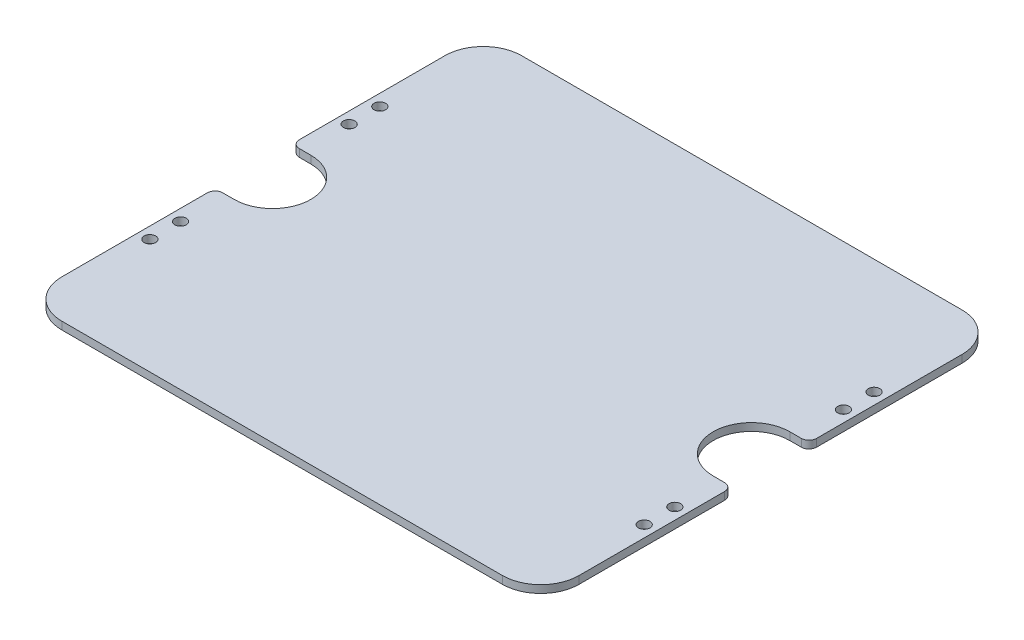
ISO-10303-21;
HEADER;
FILE_DESCRIPTION(('STEP AP214'),'2;1');
FILE_NAME('part.step','',(''),(''),'','','');
FILE_SCHEMA(('AUTOMOTIVE_DESIGN { 1 0 10303 214 1 1 1 1 }'));
ENDSEC;
DATA;
#1=APPLICATION_CONTEXT('core data for automotive mechanical design processes');
#2=APPLICATION_PROTOCOL_DEFINITION('international standard','automotive_design',2000,#1);
#3=PRODUCT_CONTEXT('',#1,'mechanical');
#4=PRODUCT('Part','Part','',(#3));
#5=PRODUCT_RELATED_PRODUCT_CATEGORY('part','',(#4));
#6=PRODUCT_DEFINITION_FORMATION('','',#4);
#7=PRODUCT_DEFINITION_CONTEXT('part definition',#1,'design');
#8=PRODUCT_DEFINITION('design','',#6,#7);
#9=PRODUCT_DEFINITION_SHAPE('','',#8);
#10=(LENGTH_UNIT() NAMED_UNIT(*) SI_UNIT(.MILLI.,.METRE.));
#11=(NAMED_UNIT(*) PLANE_ANGLE_UNIT() SI_UNIT($,.RADIAN.));
#12=(NAMED_UNIT(*) SI_UNIT($,.STERADIAN.) SOLID_ANGLE_UNIT());
#13=UNCERTAINTY_MEASURE_WITH_UNIT(LENGTH_MEASURE(1.E-05),#10,'distance_accuracy_value','');
#14=(GEOMETRIC_REPRESENTATION_CONTEXT(3) GLOBAL_UNCERTAINTY_ASSIGNED_CONTEXT((#13)) GLOBAL_UNIT_ASSIGNED_CONTEXT((#10,
#11,#12)) REPRESENTATION_CONTEXT('',''));
#15=CARTESIAN_POINT('',(0.,0.,0.));
#16=DIRECTION('',(0.,0.,1.));
#17=DIRECTION('',(1.,0.,0.));
#18=AXIS2_PLACEMENT_3D('',#15,#16,#17);
#19=CARTESIAN_POINT('',(-62.5,2.,0.));
#20=DIRECTION('',(0.,-1.,0.));
#21=DIRECTION('',(0.,0.,-1.));
#22=AXIS2_PLACEMENT_3D('',#19,#20,#21);
#23=PLANE('',#22);
#24=CARTESIAN_POINT('',(-62.5,2.,0.));
#25=DIRECTION('',(0.,-1.,0.));
#26=DIRECTION('',(0.,0.,-1.));
#27=AXIS2_PLACEMENT_3D('',#24,#25,#26);
#28=CIRCLE('',#27,10.);
#29=CARTESIAN_POINT('',(-62.5,2.,-9.99999999999999));
#30=VERTEX_POINT('',#29);
#31=CARTESIAN_POINT('',(-62.5,2.,10.));
#32=VERTEX_POINT('',#31);
#33=EDGE_CURVE('E245',#30,#32,#28,.T.);
#34=ORIENTED_EDGE('',*,*,#33,.T.);
#35=DIRECTION('',(-1.,0.,0.));
#36=VECTOR('',#35,1.);
#37=CARTESIAN_POINT('',(-65.5,2.,10.));
#38=LINE('',#37,#36);
#39=CARTESIAN_POINT('',(-65.5,2.,10.));
#40=VERTEX_POINT('',#39);
#41=EDGE_CURVE('E133',#32,#40,#38,.T.);
#42=ORIENTED_EDGE('',*,*,#41,.T.);
#43=CARTESIAN_POINT('',(-65.5,2.,12.));
#44=DIRECTION('',(0.,1.,0.));
#45=DIRECTION('',(0.,0.,-1.));
#46=AXIS2_PLACEMENT_3D('',#43,#44,#45);
#47=CIRCLE('',#46,2.);
#48=CARTESIAN_POINT('',(-67.5,2.,12.));
#49=VERTEX_POINT('',#48);
#50=EDGE_CURVE('E296',#40,#49,#47,.T.);
#51=ORIENTED_EDGE('',*,*,#50,.T.);
#52=DIRECTION('',(0.,0.,1.));
#53=VECTOR('',#52,1.);
#54=CARTESIAN_POINT('',(-67.5,2.,12.));
#55=LINE('',#54,#53);
#56=CARTESIAN_POINT('',(-67.5,2.,49.9999999999999));
#57=VERTEX_POINT('',#56);
#58=EDGE_CURVE('E315',#49,#57,#55,.T.);
#59=ORIENTED_EDGE('',*,*,#58,.T.);
#60=CARTESIAN_POINT('',(-57.5,2.,50.));
#61=DIRECTION('',(0.,1.,0.));
#62=DIRECTION('',(0.,0.,-1.));
#63=AXIS2_PLACEMENT_3D('',#60,#61,#62);
#64=CIRCLE('',#63,9.99999999999999);
#65=CARTESIAN_POINT('',(-57.4999999999999,2.,60.));
#66=VERTEX_POINT('',#65);
#67=EDGE_CURVE('E312',#57,#66,#64,.T.);
#68=ORIENTED_EDGE('',*,*,#67,.T.);
#69=DIRECTION('',(1.,0.,0.));
#70=VECTOR('',#69,1.);
#71=CARTESIAN_POINT('',(-57.4999999999999,2.,60.));
#72=LINE('',#71,#70);
#73=CARTESIAN_POINT('',(57.4999999999999,2.,60.));
#74=VERTEX_POINT('',#73);
#75=EDGE_CURVE('E314',#66,#74,#72,.T.);
#76=ORIENTED_EDGE('',*,*,#75,.T.);
#77=CARTESIAN_POINT('',(57.5,2.,50.));
#78=DIRECTION('',(0.,1.,0.));
#79=DIRECTION('',(0.,0.,1.));
#80=AXIS2_PLACEMENT_3D('',#77,#78,#79);
#81=CIRCLE('',#80,10.);
#82=CARTESIAN_POINT('',(67.5,2.,49.9999999999999));
#83=VERTEX_POINT('',#82);
#84=EDGE_CURVE('E317',#74,#83,#81,.T.);
#85=ORIENTED_EDGE('',*,*,#84,.T.);
#86=DIRECTION('',(0.,0.,-1.));
#87=VECTOR('',#86,1.);
#88=CARTESIAN_POINT('',(67.5,2.,12.));
#89=LINE('',#88,#87);
#90=CARTESIAN_POINT('',(67.5,2.,12.));
#91=VERTEX_POINT('',#90);
#92=EDGE_CURVE('E323',#83,#91,#89,.T.);
#93=ORIENTED_EDGE('',*,*,#92,.T.);
#94=CARTESIAN_POINT('',(65.5,2.,12.));
#95=DIRECTION('',(0.,1.,0.));
#96=DIRECTION('',(0.,0.,1.));
#97=AXIS2_PLACEMENT_3D('',#94,#95,#96);
#98=CIRCLE('',#97,2.);
#99=CARTESIAN_POINT('',(65.5,2.,10.));
#100=VERTEX_POINT('',#99);
#101=EDGE_CURVE('E325',#91,#100,#98,.T.);
#102=ORIENTED_EDGE('',*,*,#101,.T.);
#103=DIRECTION('',(-1.,0.,0.));
#104=VECTOR('',#103,1.);
#105=CARTESIAN_POINT('',(65.5,2.,10.));
#106=LINE('',#105,#104);
#107=CARTESIAN_POINT('',(62.5,2.,10.));
#108=VERTEX_POINT('',#107);
#109=EDGE_CURVE('E327',#100,#108,#106,.T.);
#110=ORIENTED_EDGE('',*,*,#109,.T.);
#111=CARTESIAN_POINT('',(62.5,2.,0.));
#112=DIRECTION('',(0.,-1.,0.));
#113=DIRECTION('',(0.,0.,1.));
#114=AXIS2_PLACEMENT_3D('',#111,#112,#113);
#115=CIRCLE('',#114,10.);
#116=CARTESIAN_POINT('',(62.5,2.,-9.99999999999999));
#117=VERTEX_POINT('',#116);
#118=EDGE_CURVE('E329',#108,#117,#115,.T.);
#119=ORIENTED_EDGE('',*,*,#118,.T.);
#120=DIRECTION('',(1.,0.,0.));
#121=VECTOR('',#120,1.);
#122=CARTESIAN_POINT('',(65.5,2.,-9.99999999999999));
#123=LINE('',#122,#121);
#124=CARTESIAN_POINT('',(65.5,2.,-9.99999999999999));
#125=VERTEX_POINT('',#124);
#126=EDGE_CURVE('E331',#117,#125,#123,.T.);
#127=ORIENTED_EDGE('',*,*,#126,.T.);
#128=CARTESIAN_POINT('',(65.5,2.,-12.));
#129=DIRECTION('',(0.,1.,0.));
#130=DIRECTION('',(0.,0.,-1.));
#131=AXIS2_PLACEMENT_3D('',#128,#129,#130);
#132=CIRCLE('',#131,2.);
#133=CARTESIAN_POINT('',(67.5,2.,-12.));
#134=VERTEX_POINT('',#133);
#135=EDGE_CURVE('E333',#125,#134,#132,.T.);
#136=ORIENTED_EDGE('',*,*,#135,.T.);
#137=DIRECTION('',(0.,0.,-1.));
#138=VECTOR('',#137,1.);
#139=CARTESIAN_POINT('',(67.5,2.,-49.9999999999999));
#140=LINE('',#139,#138);
#141=CARTESIAN_POINT('',(67.5,2.,-49.9999999999999));
#142=VERTEX_POINT('',#141);
#143=EDGE_CURVE('E335',#134,#142,#140,.T.);
#144=ORIENTED_EDGE('',*,*,#143,.T.);
#145=CARTESIAN_POINT('',(57.5,2.,-50.));
#146=DIRECTION('',(0.,1.,0.));
#147=DIRECTION('',(0.,0.,1.));
#148=AXIS2_PLACEMENT_3D('',#145,#146,#147);
#149=CIRCLE('',#148,10.);
#150=CARTESIAN_POINT('',(57.4999999999999,2.,-60.));
#151=VERTEX_POINT('',#150);
#152=EDGE_CURVE('E337',#142,#151,#149,.T.);
#153=ORIENTED_EDGE('',*,*,#152,.T.);
#154=DIRECTION('',(-1.,0.,0.));
#155=VECTOR('',#154,1.);
#156=CARTESIAN_POINT('',(-57.4999999999999,2.,-60.));
#157=LINE('',#156,#155);
#158=CARTESIAN_POINT('',(-57.5,2.,-60.));
#159=VERTEX_POINT('',#158);
#160=EDGE_CURVE('E339',#151,#159,#157,.T.);
#161=ORIENTED_EDGE('',*,*,#160,.T.);
#162=CARTESIAN_POINT('',(-57.5,2.,-50.));
#163=DIRECTION('',(0.,1.,0.));
#164=DIRECTION('',(0.,0.,-1.));
#165=AXIS2_PLACEMENT_3D('',#162,#163,#164);
#166=CIRCLE('',#165,10.);
#167=CARTESIAN_POINT('',(-67.5,2.,-49.9999999999999));
#168=VERTEX_POINT('',#167);
#169=EDGE_CURVE('E188',#159,#168,#166,.T.);
#170=ORIENTED_EDGE('',*,*,#169,.T.);
#171=DIRECTION('',(0.,0.,1.));
#172=VECTOR('',#171,1.);
#173=CARTESIAN_POINT('',(-67.5,2.,-49.9999999999999));
#174=LINE('',#173,#172);
#175=CARTESIAN_POINT('',(-67.5,2.,-12.));
#176=VERTEX_POINT('',#175);
#177=EDGE_CURVE('E182',#168,#176,#174,.T.);
#178=ORIENTED_EDGE('',*,*,#177,.T.);
#179=CARTESIAN_POINT('',(-65.5,2.,-12.));
#180=DIRECTION('',(0.,1.,0.));
#181=DIRECTION('',(0.,0.,-1.));
#182=AXIS2_PLACEMENT_3D('',#179,#180,#181);
#183=CIRCLE('',#182,2.);
#184=CARTESIAN_POINT('',(-65.5,2.,-9.99999999999999));
#185=VERTEX_POINT('',#184);
#186=EDGE_CURVE('E186',#176,#185,#183,.T.);
#187=ORIENTED_EDGE('',*,*,#186,.T.);
#188=DIRECTION('',(1.,0.,0.));
#189=VECTOR('',#188,1.);
#190=CARTESIAN_POINT('',(-65.5,2.,-9.99999999999999));
#191=LINE('',#190,#189);
#192=EDGE_CURVE('E54',#185,#30,#191,.T.);
#193=ORIENTED_EDGE('',*,*,#192,.T.);
#194=EDGE_LOOP('',(#34,#42,#51,#59,#68,#76,#85,#93,#102,#110,#119,#127,#136,#144,#153,#161,#170,
#178,#187,#193));
#195=FACE_BOUND('',#194,.T.);
#196=CARTESIAN_POINT('',(-64.5,2.,-30.));
#197=DIRECTION('',(0.,1.,0.));
#198=DIRECTION('',(0.,0.,1.));
#199=AXIS2_PLACEMENT_3D('',#196,#197,#198);
#200=CIRCLE('',#199,1.5);
#201=CARTESIAN_POINT('',(-64.5,2.,-28.5));
#202=VERTEX_POINT('',#201);
#203=EDGE_CURVE('E210',#202,#202,#200,.T.);
#204=ORIENTED_EDGE('',*,*,#203,.F.);
#205=EDGE_LOOP('',(#204));
#206=FACE_BOUND('',#205,.T.);
#207=CARTESIAN_POINT('',(64.5,2.,-30.));
#208=DIRECTION('',(0.,1.,0.));
#209=DIRECTION('',(0.,0.,1.));
#210=AXIS2_PLACEMENT_3D('',#207,#208,#209);
#211=CIRCLE('',#210,1.5);
#212=CARTESIAN_POINT('',(64.5,2.,-28.5));
#213=VERTEX_POINT('',#212);
#214=EDGE_CURVE('E443',#213,#213,#211,.T.);
#215=ORIENTED_EDGE('',*,*,#214,.F.);
#216=EDGE_LOOP('',(#215));
#217=FACE_BOUND('',#216,.T.);
#218=CARTESIAN_POINT('',(64.5,2.,30.));
#219=DIRECTION('',(0.,1.,0.));
#220=DIRECTION('',(0.,0.,1.));
#221=AXIS2_PLACEMENT_3D('',#218,#219,#220);
#222=CIRCLE('',#221,1.5);
#223=CARTESIAN_POINT('',(64.5,2.,31.5));
#224=VERTEX_POINT('',#223);
#225=EDGE_CURVE('E437',#224,#224,#222,.T.);
#226=ORIENTED_EDGE('',*,*,#225,.F.);
#227=EDGE_LOOP('',(#226));
#228=FACE_BOUND('',#227,.T.);
#229=CARTESIAN_POINT('',(-64.5,2.,30.));
#230=DIRECTION('',(0.,1.,0.));
#231=DIRECTION('',(0.,0.,1.));
#232=AXIS2_PLACEMENT_3D('',#229,#230,#231);
#233=CIRCLE('',#232,1.5);
#234=CARTESIAN_POINT('',(-64.5,2.,31.5));
#235=VERTEX_POINT('',#234);
#236=EDGE_CURVE('E431',#235,#235,#233,.T.);
#237=ORIENTED_EDGE('',*,*,#236,.F.);
#238=EDGE_LOOP('',(#237));
#239=FACE_BOUND('',#238,.T.);
#240=CARTESIAN_POINT('',(-64.5,2.,-22.));
#241=DIRECTION('',(0.,1.,0.));
#242=DIRECTION('',(0.,0.,1.));
#243=AXIS2_PLACEMENT_3D('',#240,#241,#242);
#244=CIRCLE('',#243,1.5);
#245=CARTESIAN_POINT('',(-64.5,2.,-20.5));
#246=VERTEX_POINT('',#245);
#247=EDGE_CURVE('E425',#246,#246,#244,.T.);
#248=ORIENTED_EDGE('',*,*,#247,.F.);
#249=EDGE_LOOP('',(#248));
#250=FACE_BOUND('',#249,.T.);
#251=CARTESIAN_POINT('',(64.5,2.,-22.));
#252=DIRECTION('',(0.,1.,0.));
#253=DIRECTION('',(0.,0.,-1.));
#254=AXIS2_PLACEMENT_3D('',#251,#252,#253);
#255=CIRCLE('',#254,1.5);
#256=CARTESIAN_POINT('',(64.5,2.,-23.5));
#257=VERTEX_POINT('',#256);
#258=EDGE_CURVE('E419',#257,#257,#255,.T.);
#259=ORIENTED_EDGE('',*,*,#258,.F.);
#260=EDGE_LOOP('',(#259));
#261=FACE_BOUND('',#260,.T.);
#262=CARTESIAN_POINT('',(64.5,2.,22.));
#263=DIRECTION('',(0.,1.,0.));
#264=DIRECTION('',(0.,0.,1.));
#265=AXIS2_PLACEMENT_3D('',#262,#263,#264);
#266=CIRCLE('',#265,1.5);
#267=CARTESIAN_POINT('',(64.5,2.,23.5));
#268=VERTEX_POINT('',#267);
#269=EDGE_CURVE('E413',#268,#268,#266,.T.);
#270=ORIENTED_EDGE('',*,*,#269,.F.);
#271=EDGE_LOOP('',(#270));
#272=FACE_BOUND('',#271,.T.);
#273=CARTESIAN_POINT('',(-64.5,2.,22.));
#274=DIRECTION('',(0.,1.,0.));
#275=DIRECTION('',(0.,0.,-1.));
#276=AXIS2_PLACEMENT_3D('',#273,#274,#275);
#277=CIRCLE('',#276,1.5);
#278=CARTESIAN_POINT('',(-64.5,2.,20.5));
#279=VERTEX_POINT('',#278);
#280=EDGE_CURVE('E404',#279,#279,#277,.T.);
#281=ORIENTED_EDGE('',*,*,#280,.F.);
#282=EDGE_LOOP('',(#281));
#283=FACE_BOUND('',#282,.T.);
#284=ADVANCED_FACE('F37',(#195,#206,#217,#228,#239,#250,#261,#272,#283),#23,.F.);
#285=CARTESIAN_POINT('',(-62.5,0.,0.));
#286=DIRECTION('',(0.,-1.,0.));
#287=DIRECTION('',(0.,0.,-1.));
#288=AXIS2_PLACEMENT_3D('',#285,#286,#287);
#289=PLANE('',#288);
#290=CARTESIAN_POINT('',(64.5,0.,22.));
#291=DIRECTION('',(0.,1.,0.));
#292=DIRECTION('',(0.,0.,1.));
#293=AXIS2_PLACEMENT_3D('',#290,#291,#292);
#294=CIRCLE('',#293,1.5);
#295=CARTESIAN_POINT('',(64.5,0.,23.5));
#296=VERTEX_POINT('',#295);
#297=EDGE_CURVE('E410',#296,#296,#294,.T.);
#298=ORIENTED_EDGE('',*,*,#297,.T.);
#299=EDGE_LOOP('',(#298));
#300=FACE_BOUND('',#299,.T.);
#301=CARTESIAN_POINT('',(-64.5,0.,-22.));
#302=DIRECTION('',(0.,1.,0.));
#303=DIRECTION('',(0.,0.,1.));
#304=AXIS2_PLACEMENT_3D('',#301,#302,#303);
#305=CIRCLE('',#304,1.5);
#306=CARTESIAN_POINT('',(-64.5,0.,-20.5));
#307=VERTEX_POINT('',#306);
#308=EDGE_CURVE('E422',#307,#307,#305,.T.);
#309=ORIENTED_EDGE('',*,*,#308,.T.);
#310=EDGE_LOOP('',(#309));
#311=FACE_BOUND('',#310,.T.);
#312=CARTESIAN_POINT('',(64.5,0.,30.));
#313=DIRECTION('',(0.,1.,0.));
#314=DIRECTION('',(0.,0.,1.));
#315=AXIS2_PLACEMENT_3D('',#312,#313,#314);
#316=CIRCLE('',#315,1.5);
#317=CARTESIAN_POINT('',(64.5,0.,31.5));
#318=VERTEX_POINT('',#317);
#319=EDGE_CURVE('E434',#318,#318,#316,.T.);
#320=ORIENTED_EDGE('',*,*,#319,.T.);
#321=EDGE_LOOP('',(#320));
#322=FACE_BOUND('',#321,.T.);
#323=CARTESIAN_POINT('',(-64.5,0.,-30.));
#324=DIRECTION('',(0.,1.,0.));
#325=DIRECTION('',(0.,0.,1.));
#326=AXIS2_PLACEMENT_3D('',#323,#324,#325);
#327=CIRCLE('',#326,1.5);
#328=CARTESIAN_POINT('',(-64.5,0.,-28.5));
#329=VERTEX_POINT('',#328);
#330=EDGE_CURVE('E446',#329,#329,#327,.T.);
#331=ORIENTED_EDGE('',*,*,#330,.T.);
#332=EDGE_LOOP('',(#331));
#333=FACE_BOUND('',#332,.T.);
#334=CARTESIAN_POINT('',(-62.5,0.,0.));
#335=DIRECTION('',(0.,-1.,0.));
#336=DIRECTION('',(0.,0.,-1.));
#337=AXIS2_PLACEMENT_3D('',#334,#335,#336);
#338=CIRCLE('',#337,10.);
#339=CARTESIAN_POINT('',(-62.5,0.,-9.99999999999999));
#340=VERTEX_POINT('',#339);
#341=CARTESIAN_POINT('',(-62.5,0.,10.));
#342=VERTEX_POINT('',#341);
#343=EDGE_CURVE('E206',#340,#342,#338,.T.);
#344=ORIENTED_EDGE('',*,*,#343,.F.);
#345=DIRECTION('',(1.,0.,0.));
#346=VECTOR('',#345,1.);
#347=CARTESIAN_POINT('',(-65.5,0.,-9.99999999999999));
#348=LINE('',#347,#346);
#349=CARTESIAN_POINT('',(-65.5,0.,-9.99999999999999));
#350=VERTEX_POINT('',#349);
#351=EDGE_CURVE('E125',#350,#340,#348,.T.);
#352=ORIENTED_EDGE('',*,*,#351,.F.);
#353=CARTESIAN_POINT('',(-65.5,0.,-12.));
#354=DIRECTION('',(0.,1.,0.));
#355=DIRECTION('',(0.,0.,-1.));
#356=AXIS2_PLACEMENT_3D('',#353,#354,#355);
#357=CIRCLE('',#356,2.);
#358=CARTESIAN_POINT('',(-67.5,0.,-12.));
#359=VERTEX_POINT('',#358);
#360=EDGE_CURVE('E119',#359,#350,#357,.T.);
#361=ORIENTED_EDGE('',*,*,#360,.F.);
#362=DIRECTION('',(0.,0.,1.));
#363=VECTOR('',#362,1.);
#364=CARTESIAN_POINT('',(-67.5,0.,-49.9999999999999));
#365=LINE('',#364,#363);
#366=CARTESIAN_POINT('',(-67.5,0.,-49.9999999999999));
#367=VERTEX_POINT('',#366);
#368=EDGE_CURVE('E196',#367,#359,#365,.T.);
#369=ORIENTED_EDGE('',*,*,#368,.F.);
#370=CARTESIAN_POINT('',(-57.5,0.,-50.));
#371=DIRECTION('',(0.,1.,0.));
#372=DIRECTION('',(0.,0.,-1.));
#373=AXIS2_PLACEMENT_3D('',#370,#371,#372);
#374=CIRCLE('',#373,10.);
#375=CARTESIAN_POINT('',(-57.5,0.,-60.));
#376=VERTEX_POINT('',#375);
#377=EDGE_CURVE('E240',#376,#367,#374,.T.);
#378=ORIENTED_EDGE('',*,*,#377,.F.);
#379=DIRECTION('',(-1.,0.,0.));
#380=VECTOR('',#379,1.);
#381=CARTESIAN_POINT('',(-57.4999999999999,0.,-60.));
#382=LINE('',#381,#380);
#383=CARTESIAN_POINT('',(57.4999999999999,0.,-60.));
#384=VERTEX_POINT('',#383);
#385=EDGE_CURVE('E238',#384,#376,#382,.T.);
#386=ORIENTED_EDGE('',*,*,#385,.F.);
#387=CARTESIAN_POINT('',(57.5,0.,-50.));
#388=DIRECTION('',(0.,1.,0.));
#389=DIRECTION('',(0.,0.,1.));
#390=AXIS2_PLACEMENT_3D('',#387,#388,#389);
#391=CIRCLE('',#390,10.);
#392=CARTESIAN_POINT('',(67.5,0.,-49.9999999999999));
#393=VERTEX_POINT('',#392);
#394=EDGE_CURVE('E236',#393,#384,#391,.T.);
#395=ORIENTED_EDGE('',*,*,#394,.F.);
#396=DIRECTION('',(0.,0.,-1.));
#397=VECTOR('',#396,1.);
#398=CARTESIAN_POINT('',(67.5,0.,-49.9999999999999));
#399=LINE('',#398,#397);
#400=CARTESIAN_POINT('',(67.5,0.,-12.));
#401=VERTEX_POINT('',#400);
#402=EDGE_CURVE('E234',#401,#393,#399,.T.);
#403=ORIENTED_EDGE('',*,*,#402,.F.);
#404=CARTESIAN_POINT('',(65.5,0.,-12.));
#405=DIRECTION('',(0.,1.,0.));
#406=DIRECTION('',(0.,0.,-1.));
#407=AXIS2_PLACEMENT_3D('',#404,#405,#406);
#408=CIRCLE('',#407,2.);
#409=CARTESIAN_POINT('',(65.5,0.,-9.99999999999999));
#410=VERTEX_POINT('',#409);
#411=EDGE_CURVE('E232',#410,#401,#408,.T.);
#412=ORIENTED_EDGE('',*,*,#411,.F.);
#413=DIRECTION('',(1.,0.,0.));
#414=VECTOR('',#413,1.);
#415=CARTESIAN_POINT('',(65.5,0.,-9.99999999999999));
#416=LINE('',#415,#414);
#417=CARTESIAN_POINT('',(62.5,0.,-9.99999999999999));
#418=VERTEX_POINT('',#417);
#419=EDGE_CURVE('E230',#418,#410,#416,.T.);
#420=ORIENTED_EDGE('',*,*,#419,.F.);
#421=CARTESIAN_POINT('',(62.5,0.,0.));
#422=DIRECTION('',(0.,-1.,0.));
#423=DIRECTION('',(0.,0.,1.));
#424=AXIS2_PLACEMENT_3D('',#421,#422,#423);
#425=CIRCLE('',#424,10.);
#426=CARTESIAN_POINT('',(62.5,0.,10.));
#427=VERTEX_POINT('',#426);
#428=EDGE_CURVE('E228',#427,#418,#425,.T.);
#429=ORIENTED_EDGE('',*,*,#428,.F.);
#430=DIRECTION('',(-1.,0.,0.));
#431=VECTOR('',#430,1.);
#432=CARTESIAN_POINT('',(65.5,0.,10.));
#433=LINE('',#432,#431);
#434=CARTESIAN_POINT('',(65.5,0.,10.));
#435=VERTEX_POINT('',#434);
#436=EDGE_CURVE('E226',#435,#427,#433,.T.);
#437=ORIENTED_EDGE('',*,*,#436,.F.);
#438=CARTESIAN_POINT('',(65.5,0.,12.));
#439=DIRECTION('',(0.,1.,0.));
#440=DIRECTION('',(0.,0.,1.));
#441=AXIS2_PLACEMENT_3D('',#438,#439,#440);
#442=CIRCLE('',#441,2.);
#443=CARTESIAN_POINT('',(67.5,0.,12.));
#444=VERTEX_POINT('',#443);
#445=EDGE_CURVE('E224',#444,#435,#442,.T.);
#446=ORIENTED_EDGE('',*,*,#445,.F.);
#447=DIRECTION('',(0.,0.,-1.));
#448=VECTOR('',#447,1.);
#449=CARTESIAN_POINT('',(67.5,0.,12.));
#450=LINE('',#449,#448);
#451=CARTESIAN_POINT('',(67.5,0.,49.9999999999999));
#452=VERTEX_POINT('',#451);
#453=EDGE_CURVE('E222',#452,#444,#450,.T.);
#454=ORIENTED_EDGE('',*,*,#453,.F.);
#455=CARTESIAN_POINT('',(57.5,0.,50.));
#456=DIRECTION('',(0.,1.,0.));
#457=DIRECTION('',(0.,0.,1.));
#458=AXIS2_PLACEMENT_3D('',#455,#456,#457);
#459=CIRCLE('',#458,10.);
#460=CARTESIAN_POINT('',(57.4999999999999,0.,60.));
#461=VERTEX_POINT('',#460);
#462=EDGE_CURVE('E220',#461,#452,#459,.T.);
#463=ORIENTED_EDGE('',*,*,#462,.F.);
#464=DIRECTION('',(1.,0.,0.));
#465=VECTOR('',#464,1.);
#466=CARTESIAN_POINT('',(-57.4999999999999,0.,60.));
#467=LINE('',#466,#465);
#468=CARTESIAN_POINT('',(-57.4999999999999,0.,60.));
#469=VERTEX_POINT('',#468);
#470=EDGE_CURVE('E218',#469,#461,#467,.T.);
#471=ORIENTED_EDGE('',*,*,#470,.F.);
#472=CARTESIAN_POINT('',(-57.5,0.,50.));
#473=DIRECTION('',(0.,1.,0.));
#474=DIRECTION('',(0.,0.,-1.));
#475=AXIS2_PLACEMENT_3D('',#472,#473,#474);
#476=CIRCLE('',#475,9.99999999999999);
#477=CARTESIAN_POINT('',(-67.5,0.,49.9999999999999));
#478=VERTEX_POINT('',#477);
#479=EDGE_CURVE('E216',#478,#469,#476,.T.);
#480=ORIENTED_EDGE('',*,*,#479,.F.);
#481=DIRECTION('',(0.,0.,1.));
#482=VECTOR('',#481,1.);
#483=CARTESIAN_POINT('',(-67.5,0.,12.));
#484=LINE('',#483,#482);
#485=CARTESIAN_POINT('',(-67.5,0.,12.));
#486=VERTEX_POINT('',#485);
#487=EDGE_CURVE('E214',#486,#478,#484,.T.);
#488=ORIENTED_EDGE('',*,*,#487,.F.);
#489=CARTESIAN_POINT('',(-65.5,0.,12.));
#490=DIRECTION('',(0.,1.,0.));
#491=DIRECTION('',(0.,0.,-1.));
#492=AXIS2_PLACEMENT_3D('',#489,#490,#491);
#493=CIRCLE('',#492,2.);
#494=CARTESIAN_POINT('',(-65.5,0.,10.));
#495=VERTEX_POINT('',#494);
#496=EDGE_CURVE('E212',#495,#486,#493,.T.);
#497=ORIENTED_EDGE('',*,*,#496,.F.);
#498=DIRECTION('',(-1.,0.,0.));
#499=VECTOR('',#498,1.);
#500=CARTESIAN_POINT('',(-65.5,0.,10.));
#501=LINE('',#500,#499);
#502=EDGE_CURVE('E209',#342,#495,#501,.T.);
#503=ORIENTED_EDGE('',*,*,#502,.F.);
#504=EDGE_LOOP('',(#344,#352,#361,#369,#378,#386,#395,#403,#412,#420,#429,#437,#446,#454,#463,
#471,#480,#488,#497,#503));
#505=FACE_BOUND('',#504,.T.);
#506=CARTESIAN_POINT('',(64.5,0.,-30.));
#507=DIRECTION('',(0.,1.,0.));
#508=DIRECTION('',(0.,0.,1.));
#509=AXIS2_PLACEMENT_3D('',#506,#507,#508);
#510=CIRCLE('',#509,1.5);
#511=CARTESIAN_POINT('',(64.5,0.,-28.5));
#512=VERTEX_POINT('',#511);
#513=EDGE_CURVE('E440',#512,#512,#510,.T.);
#514=ORIENTED_EDGE('',*,*,#513,.T.);
#515=EDGE_LOOP('',(#514));
#516=FACE_BOUND('',#515,.T.);
#517=CARTESIAN_POINT('',(-64.5,0.,30.));
#518=DIRECTION('',(0.,1.,0.));
#519=DIRECTION('',(0.,0.,1.));
#520=AXIS2_PLACEMENT_3D('',#517,#518,#519);
#521=CIRCLE('',#520,1.5);
#522=CARTESIAN_POINT('',(-64.5,0.,31.5));
#523=VERTEX_POINT('',#522);
#524=EDGE_CURVE('E428',#523,#523,#521,.T.);
#525=ORIENTED_EDGE('',*,*,#524,.T.);
#526=EDGE_LOOP('',(#525));
#527=FACE_BOUND('',#526,.T.);
#528=CARTESIAN_POINT('',(64.5,0.,-22.));
#529=DIRECTION('',(0.,1.,0.));
#530=DIRECTION('',(0.,0.,-1.));
#531=AXIS2_PLACEMENT_3D('',#528,#529,#530);
#532=CIRCLE('',#531,1.5);
#533=CARTESIAN_POINT('',(64.5,0.,-23.5));
#534=VERTEX_POINT('',#533);
#535=EDGE_CURVE('E416',#534,#534,#532,.T.);
#536=ORIENTED_EDGE('',*,*,#535,.T.);
#537=EDGE_LOOP('',(#536));
#538=FACE_BOUND('',#537,.T.);
#539=CARTESIAN_POINT('',(-64.5,0.,22.));
#540=DIRECTION('',(0.,1.,0.));
#541=DIRECTION('',(0.,0.,-1.));
#542=AXIS2_PLACEMENT_3D('',#539,#540,#541);
#543=CIRCLE('',#542,1.5);
#544=CARTESIAN_POINT('',(-64.5,0.,20.5));
#545=VERTEX_POINT('',#544);
#546=EDGE_CURVE('E407',#545,#545,#543,.T.);
#547=ORIENTED_EDGE('',*,*,#546,.T.);
#548=EDGE_LOOP('',(#547));
#549=FACE_BOUND('',#548,.T.);
#550=ADVANCED_FACE('F300',(#300,#311,#322,#333,#505,#516,#527,#538,#549),#289,.T.);
#551=CARTESIAN_POINT('',(-62.5,2.,0.));
#552=DIRECTION('',(0.,-1.,0.));
#553=DIRECTION('',(0.,0.,-1.));
#554=AXIS2_PLACEMENT_3D('',#551,#552,#553);
#555=CYLINDRICAL_SURFACE('',#554,10.);
#556=ORIENTED_EDGE('',*,*,#343,.T.);
#557=DIRECTION('',(0.,-1.,0.));
#558=VECTOR('',#557,1.);
#559=CARTESIAN_POINT('',(-62.5,2.,10.));
#560=LINE('',#559,#558);
#561=EDGE_CURVE('E11',#32,#342,#560,.T.);
#562=ORIENTED_EDGE('',*,*,#561,.F.);
#563=ORIENTED_EDGE('',*,*,#33,.F.);
#564=DIRECTION('',(0.,-1.,0.));
#565=VECTOR('',#564,1.);
#566=CARTESIAN_POINT('',(-62.5,2.,-9.99999999999999));
#567=LINE('',#566,#565);
#568=EDGE_CURVE('E202',#30,#340,#567,.T.);
#569=ORIENTED_EDGE('',*,*,#568,.T.);
#570=EDGE_LOOP('',(#556,#562,#563,#569));
#571=FACE_BOUND('',#570,.T.);
#572=ADVANCED_FACE('F39',(#571),#555,.F.);
#573=CARTESIAN_POINT('',(-65.5,2.,10.));
#574=DIRECTION('',(0.,0.,1.));
#575=DIRECTION('',(1.,0.,0.));
#576=AXIS2_PLACEMENT_3D('',#573,#574,#575);
#577=PLANE('',#576);
#578=ORIENTED_EDGE('',*,*,#502,.T.);
#579=DIRECTION('',(0.,-1.,0.));
#580=VECTOR('',#579,1.);
#581=CARTESIAN_POINT('',(-65.5,2.,10.));
#582=LINE('',#581,#580);
#583=EDGE_CURVE('E46',#40,#495,#582,.T.);
#584=ORIENTED_EDGE('',*,*,#583,.F.);
#585=ORIENTED_EDGE('',*,*,#41,.F.);
#586=ORIENTED_EDGE('',*,*,#561,.T.);
#587=EDGE_LOOP('',(#578,#584,#585,#586));
#588=FACE_BOUND('',#587,.T.);
#589=ADVANCED_FACE('F674',(#588),#577,.F.);
#590=CARTESIAN_POINT('',(-65.5,2.,12.));
#591=DIRECTION('',(0.,-1.,0.));
#592=DIRECTION('',(0.,0.,-1.));
#593=AXIS2_PLACEMENT_3D('',#590,#591,#592);
#594=CYLINDRICAL_SURFACE('',#593,2.);
#595=ORIENTED_EDGE('',*,*,#496,.T.);
#596=DIRECTION('',(0.,-1.,0.));
#597=VECTOR('',#596,1.);
#598=CARTESIAN_POINT('',(-67.5,2.,12.));
#599=LINE('',#598,#597);
#600=EDGE_CURVE('E288',#49,#486,#599,.T.);
#601=ORIENTED_EDGE('',*,*,#600,.F.);
#602=ORIENTED_EDGE('',*,*,#50,.F.);
#603=ORIENTED_EDGE('',*,*,#583,.T.);
#604=EDGE_LOOP('',(#595,#601,#602,#603));
#605=FACE_BOUND('',#604,.T.);
#606=ADVANCED_FACE('F294',(#605),#594,.T.);
#607=CARTESIAN_POINT('',(-67.5,2.,12.));
#608=DIRECTION('',(1.,0.,0.));
#609=DIRECTION('',(0.,0.,-1.));
#610=AXIS2_PLACEMENT_3D('',#607,#608,#609);
#611=PLANE('',#610);
#612=ORIENTED_EDGE('',*,*,#487,.T.);
#613=DIRECTION('',(0.,-1.,0.));
#614=VECTOR('',#613,1.);
#615=CARTESIAN_POINT('',(-67.5,2.,49.9999999999999));
#616=LINE('',#615,#614);
#617=EDGE_CURVE('E285',#57,#478,#616,.T.);
#618=ORIENTED_EDGE('',*,*,#617,.F.);
#619=ORIENTED_EDGE('',*,*,#58,.F.);
#620=ORIENTED_EDGE('',*,*,#600,.T.);
#621=EDGE_LOOP('',(#612,#618,#619,#620));
#622=FACE_BOUND('',#621,.T.);
#623=ADVANCED_FACE('F306',(#622),#611,.F.);
#624=CARTESIAN_POINT('',(-57.5,2.,50.));
#625=DIRECTION('',(0.,-1.,0.));
#626=DIRECTION('',(0.,0.,-1.));
#627=AXIS2_PLACEMENT_3D('',#624,#625,#626);
#628=CYLINDRICAL_SURFACE('',#627,9.99999999999999);
#629=ORIENTED_EDGE('',*,*,#479,.T.);
#630=DIRECTION('',(0.,-1.,0.));
#631=VECTOR('',#630,1.);
#632=CARTESIAN_POINT('',(-57.4999999999999,2.,60.));
#633=LINE('',#632,#631);
#634=EDGE_CURVE('E282',#66,#469,#633,.T.);
#635=ORIENTED_EDGE('',*,*,#634,.F.);
#636=ORIENTED_EDGE('',*,*,#67,.F.);
#637=ORIENTED_EDGE('',*,*,#617,.T.);
#638=EDGE_LOOP('',(#629,#635,#636,#637));
#639=FACE_BOUND('',#638,.T.);
#640=ADVANCED_FACE('F310',(#639),#628,.T.);
#641=CARTESIAN_POINT('',(-57.4999999999999,2.,60.));
#642=DIRECTION('',(0.,0.,-1.));
#643=DIRECTION('',(-1.,0.,0.));
#644=AXIS2_PLACEMENT_3D('',#641,#642,#643);
#645=PLANE('',#644);
#646=ORIENTED_EDGE('',*,*,#470,.T.);
#647=DIRECTION('',(0.,-1.,0.));
#648=VECTOR('',#647,1.);
#649=CARTESIAN_POINT('',(57.4999999999999,2.,60.));
#650=LINE('',#649,#648);
#651=EDGE_CURVE('E279',#74,#461,#650,.T.);
#652=ORIENTED_EDGE('',*,*,#651,.F.);
#653=ORIENTED_EDGE('',*,*,#75,.F.);
#654=ORIENTED_EDGE('',*,*,#634,.T.);
#655=EDGE_LOOP('',(#646,#652,#653,#654));
#656=FACE_BOUND('',#655,.T.);
#657=ADVANCED_FACE('F639',(#656),#645,.F.);
#658=CARTESIAN_POINT('',(57.5,2.,50.));
#659=DIRECTION('',(0.,-1.,0.));
#660=DIRECTION('',(0.,0.,-1.));
#661=AXIS2_PLACEMENT_3D('',#658,#659,#660);
#662=CYLINDRICAL_SURFACE('',#661,10.);
#663=ORIENTED_EDGE('',*,*,#462,.T.);
#664=DIRECTION('',(0.,-1.,0.));
#665=VECTOR('',#664,1.);
#666=CARTESIAN_POINT('',(67.5,2.,49.9999999999999));
#667=LINE('',#666,#665);
#668=EDGE_CURVE('E276',#83,#452,#667,.T.);
#669=ORIENTED_EDGE('',*,*,#668,.F.);
#670=ORIENTED_EDGE('',*,*,#84,.F.);
#671=ORIENTED_EDGE('',*,*,#651,.T.);
#672=EDGE_LOOP('',(#663,#669,#670,#671));
#673=FACE_BOUND('',#672,.T.);
#674=ADVANCED_FACE('F629',(#673),#662,.T.);
#675=CARTESIAN_POINT('',(67.5,2.,12.));
#676=DIRECTION('',(-1.,0.,0.));
#677=DIRECTION('',(0.,0.,1.));
#678=AXIS2_PLACEMENT_3D('',#675,#676,#677);
#679=PLANE('',#678);
#680=ORIENTED_EDGE('',*,*,#453,.T.);
#681=DIRECTION('',(0.,-1.,0.));
#682=VECTOR('',#681,1.);
#683=CARTESIAN_POINT('',(67.5,2.,12.));
#684=LINE('',#683,#682);
#685=EDGE_CURVE('E273',#91,#444,#684,.T.);
#686=ORIENTED_EDGE('',*,*,#685,.F.);
#687=ORIENTED_EDGE('',*,*,#92,.F.);
#688=ORIENTED_EDGE('',*,*,#668,.T.);
#689=EDGE_LOOP('',(#680,#686,#687,#688));
#690=FACE_BOUND('',#689,.T.);
#691=ADVANCED_FACE('F619',(#690),#679,.F.);
#692=CARTESIAN_POINT('',(65.5,2.,12.));
#693=DIRECTION('',(0.,-1.,0.));
#694=DIRECTION('',(0.,0.,-1.));
#695=AXIS2_PLACEMENT_3D('',#692,#693,#694);
#696=CYLINDRICAL_SURFACE('',#695,2.);
#697=ORIENTED_EDGE('',*,*,#445,.T.);
#698=DIRECTION('',(0.,-1.,0.));
#699=VECTOR('',#698,1.);
#700=CARTESIAN_POINT('',(65.5,2.,10.));
#701=LINE('',#700,#699);
#702=EDGE_CURVE('E270',#100,#435,#701,.T.);
#703=ORIENTED_EDGE('',*,*,#702,.F.);
#704=ORIENTED_EDGE('',*,*,#101,.F.);
#705=ORIENTED_EDGE('',*,*,#685,.T.);
#706=EDGE_LOOP('',(#697,#703,#704,#705));
#707=FACE_BOUND('',#706,.T.);
#708=ADVANCED_FACE('F609',(#707),#696,.T.);
#709=CARTESIAN_POINT('',(65.5,2.,10.));
#710=DIRECTION('',(0.,0.,1.));
#711=DIRECTION('',(1.,0.,0.));
#712=AXIS2_PLACEMENT_3D('',#709,#710,#711);
#713=PLANE('',#712);
#714=ORIENTED_EDGE('',*,*,#436,.T.);
#715=DIRECTION('',(0.,-1.,0.));
#716=VECTOR('',#715,1.);
#717=CARTESIAN_POINT('',(62.5,2.,10.));
#718=LINE('',#717,#716);
#719=EDGE_CURVE('E267',#108,#427,#718,.T.);
#720=ORIENTED_EDGE('',*,*,#719,.F.);
#721=ORIENTED_EDGE('',*,*,#109,.F.);
#722=ORIENTED_EDGE('',*,*,#702,.T.);
#723=EDGE_LOOP('',(#714,#720,#721,#722));
#724=FACE_BOUND('',#723,.T.);
#725=ADVANCED_FACE('F599',(#724),#713,.F.);
#726=CARTESIAN_POINT('',(62.5,2.,0.));
#727=DIRECTION('',(0.,-1.,0.));
#728=DIRECTION('',(0.,0.,-1.));
#729=AXIS2_PLACEMENT_3D('',#726,#727,#728);
#730=CYLINDRICAL_SURFACE('',#729,10.);
#731=ORIENTED_EDGE('',*,*,#428,.T.);
#732=DIRECTION('',(0.,-1.,0.));
#733=VECTOR('',#732,1.);
#734=CARTESIAN_POINT('',(62.5,2.,-9.99999999999999));
#735=LINE('',#734,#733);
#736=EDGE_CURVE('E264',#117,#418,#735,.T.);
#737=ORIENTED_EDGE('',*,*,#736,.F.);
#738=ORIENTED_EDGE('',*,*,#118,.F.);
#739=ORIENTED_EDGE('',*,*,#719,.T.);
#740=EDGE_LOOP('',(#731,#737,#738,#739));
#741=FACE_BOUND('',#740,.T.);
#742=ADVANCED_FACE('F589',(#741),#730,.F.);
#743=CARTESIAN_POINT('',(65.5,2.,-9.99999999999999));
#744=DIRECTION('',(0.,0.,-1.));
#745=DIRECTION('',(-1.,0.,0.));
#746=AXIS2_PLACEMENT_3D('',#743,#744,#745);
#747=PLANE('',#746);
#748=ORIENTED_EDGE('',*,*,#419,.T.);
#749=DIRECTION('',(0.,-1.,0.));
#750=VECTOR('',#749,1.);
#751=CARTESIAN_POINT('',(65.5,2.,-9.99999999999999));
#752=LINE('',#751,#750);
#753=EDGE_CURVE('E261',#125,#410,#752,.T.);
#754=ORIENTED_EDGE('',*,*,#753,.F.);
#755=ORIENTED_EDGE('',*,*,#126,.F.);
#756=ORIENTED_EDGE('',*,*,#736,.T.);
#757=EDGE_LOOP('',(#748,#754,#755,#756));
#758=FACE_BOUND('',#757,.T.);
#759=ADVANCED_FACE('F579',(#758),#747,.F.);
#760=CARTESIAN_POINT('',(65.5,2.,-12.));
#761=DIRECTION('',(0.,-1.,0.));
#762=DIRECTION('',(0.,0.,-1.));
#763=AXIS2_PLACEMENT_3D('',#760,#761,#762);
#764=CYLINDRICAL_SURFACE('',#763,2.);
#765=ORIENTED_EDGE('',*,*,#411,.T.);
#766=DIRECTION('',(0.,-1.,0.));
#767=VECTOR('',#766,1.);
#768=CARTESIAN_POINT('',(67.5,2.,-12.));
#769=LINE('',#768,#767);
#770=EDGE_CURVE('E258',#134,#401,#769,.T.);
#771=ORIENTED_EDGE('',*,*,#770,.F.);
#772=ORIENTED_EDGE('',*,*,#135,.F.);
#773=ORIENTED_EDGE('',*,*,#753,.T.);
#774=EDGE_LOOP('',(#765,#771,#772,#773));
#775=FACE_BOUND('',#774,.T.);
#776=ADVANCED_FACE('F569',(#775),#764,.T.);
#777=CARTESIAN_POINT('',(67.5,2.,-49.9999999999999));
#778=DIRECTION('',(-1.,0.,0.));
#779=DIRECTION('',(0.,0.,1.));
#780=AXIS2_PLACEMENT_3D('',#777,#778,#779);
#781=PLANE('',#780);
#782=ORIENTED_EDGE('',*,*,#402,.T.);
#783=DIRECTION('',(0.,-1.,0.));
#784=VECTOR('',#783,1.);
#785=CARTESIAN_POINT('',(67.5,2.,-49.9999999999999));
#786=LINE('',#785,#784);
#787=EDGE_CURVE('E255',#142,#393,#786,.T.);
#788=ORIENTED_EDGE('',*,*,#787,.F.);
#789=ORIENTED_EDGE('',*,*,#143,.F.);
#790=ORIENTED_EDGE('',*,*,#770,.T.);
#791=EDGE_LOOP('',(#782,#788,#789,#790));
#792=FACE_BOUND('',#791,.T.);
#793=ADVANCED_FACE('F559',(#792),#781,.F.);
#794=CARTESIAN_POINT('',(57.5,2.,-50.));
#795=DIRECTION('',(0.,-1.,0.));
#796=DIRECTION('',(0.,0.,-1.));
#797=AXIS2_PLACEMENT_3D('',#794,#795,#796);
#798=CYLINDRICAL_SURFACE('',#797,10.);
#799=ORIENTED_EDGE('',*,*,#394,.T.);
#800=DIRECTION('',(0.,-1.,0.));
#801=VECTOR('',#800,1.);
#802=CARTESIAN_POINT('',(57.4999999999999,2.,-60.));
#803=LINE('',#802,#801);
#804=EDGE_CURVE('E252',#151,#384,#803,.T.);
#805=ORIENTED_EDGE('',*,*,#804,.F.);
#806=ORIENTED_EDGE('',*,*,#152,.F.);
#807=ORIENTED_EDGE('',*,*,#787,.T.);
#808=EDGE_LOOP('',(#799,#805,#806,#807));
#809=FACE_BOUND('',#808,.T.);
#810=ADVANCED_FACE('F550',(#809),#798,.T.);
#811=CARTESIAN_POINT('',(-57.4999999999999,2.,-60.));
#812=DIRECTION('',(0.,0.,1.));
#813=DIRECTION('',(1.,0.,0.));
#814=AXIS2_PLACEMENT_3D('',#811,#812,#813);
#815=PLANE('',#814);
#816=ORIENTED_EDGE('',*,*,#385,.T.);
#817=DIRECTION('',(0.,-1.,0.));
#818=VECTOR('',#817,1.);
#819=CARTESIAN_POINT('',(-57.5,2.,-60.));
#820=LINE('',#819,#818);
#821=EDGE_CURVE('E249',#159,#376,#820,.T.);
#822=ORIENTED_EDGE('',*,*,#821,.F.);
#823=ORIENTED_EDGE('',*,*,#160,.F.);
#824=ORIENTED_EDGE('',*,*,#804,.T.);
#825=EDGE_LOOP('',(#816,#822,#823,#824));
#826=FACE_BOUND('',#825,.T.);
#827=ADVANCED_FACE('F345',(#826),#815,.F.);
#828=CARTESIAN_POINT('',(-57.5,2.,-50.));
#829=DIRECTION('',(0.,-1.,0.));
#830=DIRECTION('',(0.,0.,-1.));
#831=AXIS2_PLACEMENT_3D('',#828,#829,#830);
#832=CYLINDRICAL_SURFACE('',#831,10.);
#833=ORIENTED_EDGE('',*,*,#377,.T.);
#834=DIRECTION('',(0.,-1.,0.));
#835=VECTOR('',#834,1.);
#836=CARTESIAN_POINT('',(-67.5,2.,-49.9999999999999));
#837=LINE('',#836,#835);
#838=EDGE_CURVE('E197',#168,#367,#837,.T.);
#839=ORIENTED_EDGE('',*,*,#838,.F.);
#840=ORIENTED_EDGE('',*,*,#169,.F.);
#841=ORIENTED_EDGE('',*,*,#821,.T.);
#842=EDGE_LOOP('',(#833,#839,#840,#841));
#843=FACE_BOUND('',#842,.T.);
#844=ADVANCED_FACE('F349',(#843),#832,.T.);
#845=CARTESIAN_POINT('',(-67.5,2.,-49.9999999999999));
#846=DIRECTION('',(1.,0.,0.));
#847=DIRECTION('',(0.,0.,-1.));
#848=AXIS2_PLACEMENT_3D('',#845,#846,#847);
#849=PLANE('',#848);
#850=ORIENTED_EDGE('',*,*,#368,.T.);
#851=DIRECTION('',(0.,-1.,0.));
#852=VECTOR('',#851,1.);
#853=CARTESIAN_POINT('',(-67.5,2.,-12.));
#854=LINE('',#853,#852);
#855=EDGE_CURVE('E193',#176,#359,#854,.T.);
#856=ORIENTED_EDGE('',*,*,#855,.F.);
#857=ORIENTED_EDGE('',*,*,#177,.F.);
#858=ORIENTED_EDGE('',*,*,#838,.T.);
#859=EDGE_LOOP('',(#850,#856,#857,#858));
#860=FACE_BOUND('',#859,.T.);
#861=ADVANCED_FACE('F194',(#860),#849,.F.);
#862=CARTESIAN_POINT('',(-65.5,2.,-12.));
#863=DIRECTION('',(0.,-1.,0.));
#864=DIRECTION('',(0.,0.,-1.));
#865=AXIS2_PLACEMENT_3D('',#862,#863,#864);
#866=CYLINDRICAL_SURFACE('',#865,2.);
#867=ORIENTED_EDGE('',*,*,#360,.T.);
#868=DIRECTION('',(0.,-1.,0.));
#869=VECTOR('',#868,1.);
#870=CARTESIAN_POINT('',(-65.5,2.,-9.99999999999999));
#871=LINE('',#870,#869);
#872=EDGE_CURVE('E198',#185,#350,#871,.T.);
#873=ORIENTED_EDGE('',*,*,#872,.F.);
#874=ORIENTED_EDGE('',*,*,#186,.F.);
#875=ORIENTED_EDGE('',*,*,#855,.T.);
#876=EDGE_LOOP('',(#867,#873,#874,#875));
#877=FACE_BOUND('',#876,.T.);
#878=ADVANCED_FACE('F200',(#877),#866,.T.);
#879=CARTESIAN_POINT('',(-65.5,2.,-9.99999999999999));
#880=DIRECTION('',(0.,0.,-1.));
#881=DIRECTION('',(-1.,0.,0.));
#882=AXIS2_PLACEMENT_3D('',#879,#880,#881);
#883=PLANE('',#882);
#884=ORIENTED_EDGE('',*,*,#351,.T.);
#885=ORIENTED_EDGE('',*,*,#568,.F.);
#886=ORIENTED_EDGE('',*,*,#192,.F.);
#887=ORIENTED_EDGE('',*,*,#872,.T.);
#888=EDGE_LOOP('',(#884,#885,#886,#887));
#889=FACE_BOUND('',#888,.T.);
#890=ADVANCED_FACE('F353',(#889),#883,.F.);
#891=CARTESIAN_POINT('',(-64.5,2.,-30.));
#892=DIRECTION('',(0.,-1.,0.));
#893=DIRECTION('',(0.,0.,-1.));
#894=AXIS2_PLACEMENT_3D('',#891,#892,#893);
#895=CYLINDRICAL_SURFACE('',#894,1.5);
#896=ORIENTED_EDGE('',*,*,#203,.T.);
#897=EDGE_LOOP('',(#896));
#898=FACE_BOUND('',#897,.T.);
#899=ORIENTED_EDGE('',*,*,#330,.F.);
#900=EDGE_LOOP('',(#899));
#901=FACE_BOUND('',#900,.T.);
#902=ADVANCED_FACE('F355',(#898,#901),#895,.F.);
#903=CARTESIAN_POINT('',(64.5,2.,-30.));
#904=DIRECTION('',(0.,-1.,0.));
#905=DIRECTION('',(0.,0.,-1.));
#906=AXIS2_PLACEMENT_3D('',#903,#904,#905);
#907=CYLINDRICAL_SURFACE('',#906,1.5);
#908=ORIENTED_EDGE('',*,*,#214,.T.);
#909=EDGE_LOOP('',(#908));
#910=FACE_BOUND('',#909,.T.);
#911=ORIENTED_EDGE('',*,*,#513,.F.);
#912=EDGE_LOOP('',(#911));
#913=FACE_BOUND('',#912,.T.);
#914=ADVANCED_FACE('F361',(#910,#913),#907,.F.);
#915=CARTESIAN_POINT('',(64.5,2.,30.));
#916=DIRECTION('',(0.,-1.,0.));
#917=DIRECTION('',(0.,0.,-1.));
#918=AXIS2_PLACEMENT_3D('',#915,#916,#917);
#919=CYLINDRICAL_SURFACE('',#918,1.5);
#920=ORIENTED_EDGE('',*,*,#225,.T.);
#921=EDGE_LOOP('',(#920));
#922=FACE_BOUND('',#921,.T.);
#923=ORIENTED_EDGE('',*,*,#319,.F.);
#924=EDGE_LOOP('',(#923));
#925=FACE_BOUND('',#924,.T.);
#926=ADVANCED_FACE('F375',(#922,#925),#919,.F.);
#927=CARTESIAN_POINT('',(-64.5,2.,30.));
#928=DIRECTION('',(0.,-1.,0.));
#929=DIRECTION('',(0.,0.,-1.));
#930=AXIS2_PLACEMENT_3D('',#927,#928,#929);
#931=CYLINDRICAL_SURFACE('',#930,1.5);
#932=ORIENTED_EDGE('',*,*,#236,.T.);
#933=EDGE_LOOP('',(#932));
#934=FACE_BOUND('',#933,.T.);
#935=ORIENTED_EDGE('',*,*,#524,.F.);
#936=EDGE_LOOP('',(#935));
#937=FACE_BOUND('',#936,.T.);
#938=ADVANCED_FACE('F379',(#934,#937),#931,.F.);
#939=CARTESIAN_POINT('',(-64.5,2.,-22.));
#940=DIRECTION('',(0.,-1.,0.));
#941=DIRECTION('',(0.,0.,-1.));
#942=AXIS2_PLACEMENT_3D('',#939,#940,#941);
#943=CYLINDRICAL_SURFACE('',#942,1.5);
#944=ORIENTED_EDGE('',*,*,#247,.T.);
#945=EDGE_LOOP('',(#944));
#946=FACE_BOUND('',#945,.T.);
#947=ORIENTED_EDGE('',*,*,#308,.F.);
#948=EDGE_LOOP('',(#947));
#949=FACE_BOUND('',#948,.T.);
#950=ADVANCED_FACE('F383',(#946,#949),#943,.F.);
#951=CARTESIAN_POINT('',(64.5,2.,-22.));
#952=DIRECTION('',(0.,-1.,0.));
#953=DIRECTION('',(0.,0.,-1.));
#954=AXIS2_PLACEMENT_3D('',#951,#952,#953);
#955=CYLINDRICAL_SURFACE('',#954,1.5);
#956=ORIENTED_EDGE('',*,*,#258,.T.);
#957=EDGE_LOOP('',(#956));
#958=FACE_BOUND('',#957,.T.);
#959=ORIENTED_EDGE('',*,*,#535,.F.);
#960=EDGE_LOOP('',(#959));
#961=FACE_BOUND('',#960,.T.);
#962=ADVANCED_FACE('F387',(#958,#961),#955,.F.);
#963=CARTESIAN_POINT('',(64.5,2.,22.));
#964=DIRECTION('',(0.,-1.,0.));
#965=DIRECTION('',(0.,0.,-1.));
#966=AXIS2_PLACEMENT_3D('',#963,#964,#965);
#967=CYLINDRICAL_SURFACE('',#966,1.5);
#968=ORIENTED_EDGE('',*,*,#269,.T.);
#969=EDGE_LOOP('',(#968));
#970=FACE_BOUND('',#969,.T.);
#971=ORIENTED_EDGE('',*,*,#297,.F.);
#972=EDGE_LOOP('',(#971));
#973=FACE_BOUND('',#972,.T.);
#974=ADVANCED_FACE('F391',(#970,#973),#967,.F.);
#975=CARTESIAN_POINT('',(-64.5,2.,22.));
#976=DIRECTION('',(0.,-1.,0.));
#977=DIRECTION('',(0.,0.,-1.));
#978=AXIS2_PLACEMENT_3D('',#975,#976,#977);
#979=CYLINDRICAL_SURFACE('',#978,1.5);
#980=ORIENTED_EDGE('',*,*,#280,.T.);
#981=EDGE_LOOP('',(#980));
#982=FACE_BOUND('',#981,.T.);
#983=ORIENTED_EDGE('',*,*,#546,.F.);
#984=EDGE_LOOP('',(#983));
#985=FACE_BOUND('',#984,.T.);
#986=ADVANCED_FACE('F395',(#982,#985),#979,.F.);
#987=CLOSED_SHELL('',(#284,#550,#572,#589,#606,#623,#640,#657,#674,#691,#708,#725,#742,#759,
#776,#793,#810,#827,#844,#861,#878,#890,#902,#914,#926,#938,#950,#962,#974,#986));
#988=MANIFOLD_SOLID_BREP('B2',#987);
#989=ADVANCED_BREP_SHAPE_REPRESENTATION('',(#18,#988),#14);
#990=SHAPE_DEFINITION_REPRESENTATION(#9,#989);
ENDSEC;
END-ISO-10303-21;
